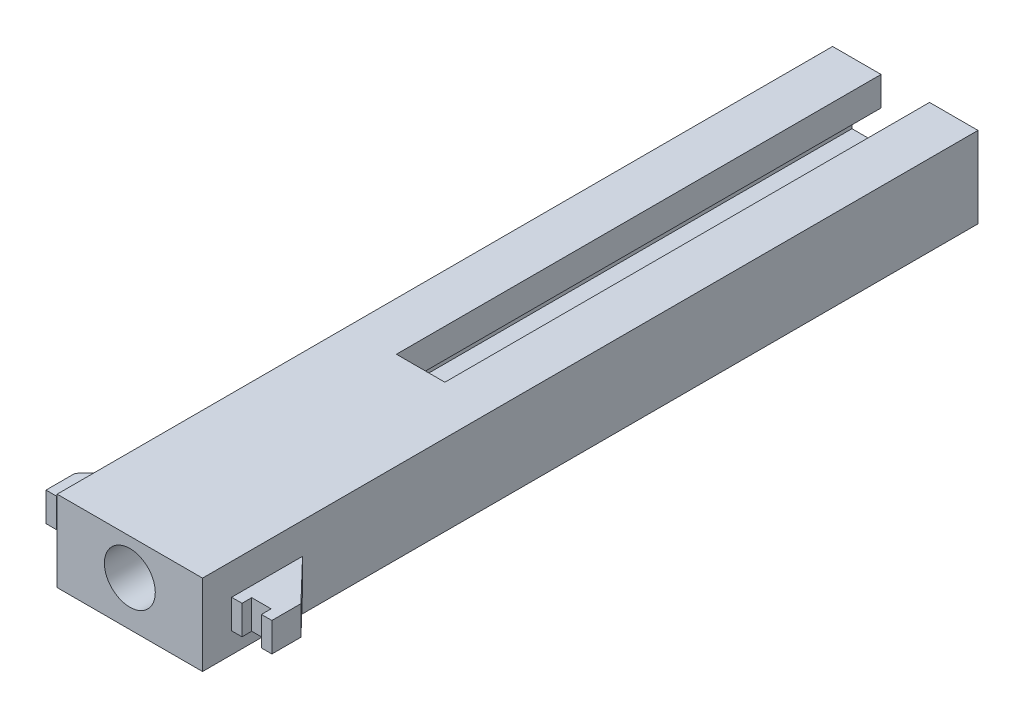
ISO-10303-21;
HEADER;
FILE_DESCRIPTION(('STEP AP214'),'2;1');
FILE_NAME('part.step','',(''),(''),'','','');
FILE_SCHEMA(('AUTOMOTIVE_DESIGN { 1 0 10303 214 1 1 1 1 }'));
ENDSEC;
DATA;
#1=APPLICATION_CONTEXT('core data for automotive mechanical design processes');
#2=APPLICATION_PROTOCOL_DEFINITION('international standard','automotive_design',2000,#1);
#3=PRODUCT_CONTEXT('',#1,'mechanical');
#4=PRODUCT('Part','Part','',(#3));
#5=PRODUCT_RELATED_PRODUCT_CATEGORY('part','',(#4));
#6=PRODUCT_DEFINITION_FORMATION('','',#4);
#7=PRODUCT_DEFINITION_CONTEXT('part definition',#1,'design');
#8=PRODUCT_DEFINITION('design','',#6,#7);
#9=PRODUCT_DEFINITION_SHAPE('','',#8);
#10=(LENGTH_UNIT() NAMED_UNIT(*) SI_UNIT(.MILLI.,.METRE.));
#11=(NAMED_UNIT(*) PLANE_ANGLE_UNIT() SI_UNIT($,.RADIAN.));
#12=(NAMED_UNIT(*) SI_UNIT($,.STERADIAN.) SOLID_ANGLE_UNIT());
#13=UNCERTAINTY_MEASURE_WITH_UNIT(LENGTH_MEASURE(1.E-05),#10,'distance_accuracy_value','');
#14=(GEOMETRIC_REPRESENTATION_CONTEXT(3) GLOBAL_UNCERTAINTY_ASSIGNED_CONTEXT((#13)) GLOBAL_UNIT_ASSIGNED_CONTEXT((#10,
#11,#12)) REPRESENTATION_CONTEXT('',''));
#15=CARTESIAN_POINT('',(0.,0.,0.));
#16=DIRECTION('',(0.,0.,1.));
#17=DIRECTION('',(1.,0.,0.));
#18=AXIS2_PLACEMENT_3D('',#15,#16,#17);
#19=CARTESIAN_POINT('',(-7.5,8.35,80.));
#20=DIRECTION('',(1.,0.,0.));
#21=DIRECTION('',(0.,1.,0.));
#22=AXIS2_PLACEMENT_3D('',#19,#20,#21);
#23=PLANE('',#22);
#24=DIRECTION('',(0.,-1.,0.));
#25=VECTOR('',#24,1.);
#26=CARTESIAN_POINT('',(-7.5,8.35,0.));
#27=LINE('',#26,#25);
#28=CARTESIAN_POINT('',(-7.5,8.35,0.));
#29=VERTEX_POINT('',#28);
#30=CARTESIAN_POINT('',(-7.5,0.,0.));
#31=VERTEX_POINT('',#30);
#32=EDGE_CURVE('E538',#29,#31,#27,.T.);
#33=ORIENTED_EDGE('',*,*,#32,.T.);
#34=DIRECTION('',(0.,0.,-1.));
#35=VECTOR('',#34,1.);
#36=CARTESIAN_POINT('',(-7.5,0.,80.));
#37=LINE('',#36,#35);
#38=CARTESIAN_POINT('',(-7.5,0.,80.));
#39=VERTEX_POINT('',#38);
#40=EDGE_CURVE('E546',#39,#31,#37,.T.);
#41=ORIENTED_EDGE('',*,*,#40,.F.);
#42=DIRECTION('',(0.,-1.,0.));
#43=VECTOR('',#42,1.);
#44=CARTESIAN_POINT('',(-7.5,8.35,80.));
#45=LINE('',#44,#43);
#46=CARTESIAN_POINT('',(-7.5,8.35,80.));
#47=VERTEX_POINT('',#46);
#48=EDGE_CURVE('E523',#47,#39,#45,.T.);
#49=ORIENTED_EDGE('',*,*,#48,.F.);
#50=DIRECTION('',(0.,0.,-1.));
#51=VECTOR('',#50,1.);
#52=CARTESIAN_POINT('',(-7.5,8.35,80.));
#53=LINE('',#52,#51);
#54=EDGE_CURVE('E550',#47,#29,#53,.T.);
#55=ORIENTED_EDGE('',*,*,#54,.T.);
#56=EDGE_LOOP('',(#33,#41,#49,#55));
#57=FACE_BOUND('',#56,.T.);
#58=DIRECTION('',(0.,1.,0.));
#59=VECTOR('',#58,1.);
#60=CARTESIAN_POINT('',(-7.5,-3.8464713053803,69.685450349093));
#61=LINE('',#60,#59);
#62=CARTESIAN_POINT('',(-7.5,2.14,69.685450349093));
#63=VERTEX_POINT('',#62);
#64=CARTESIAN_POINT('',(-7.5,5.14,69.685450349093));
#65=VERTEX_POINT('',#64);
#66=EDGE_CURVE('E272',#63,#65,#61,.T.);
#67=ORIENTED_EDGE('',*,*,#66,.T.);
#68=DIRECTION('',(0.,0.,1.));
#69=VECTOR('',#68,1.);
#70=CARTESIAN_POINT('',(-7.5,5.14,77.));
#71=LINE('',#70,#69);
#72=CARTESIAN_POINT('',(-7.5,5.14,77.));
#73=VERTEX_POINT('',#72);
#74=EDGE_CURVE('E61',#65,#73,#71,.T.);
#75=ORIENTED_EDGE('',*,*,#74,.T.);
#76=DIRECTION('',(0.,-1.,0.));
#77=VECTOR('',#76,1.);
#78=CARTESIAN_POINT('',(-7.5,5.14,77.));
#79=LINE('',#78,#77);
#80=CARTESIAN_POINT('',(-7.5,2.14,77.));
#81=VERTEX_POINT('',#80);
#82=EDGE_CURVE('E331',#73,#81,#79,.T.);
#83=ORIENTED_EDGE('',*,*,#82,.T.);
#84=DIRECTION('',(0.,0.,-1.));
#85=VECTOR('',#84,1.);
#86=CARTESIAN_POINT('',(-7.5,2.14,77.));
#87=LINE('',#86,#85);
#88=EDGE_CURVE('E68',#81,#63,#87,.T.);
#89=ORIENTED_EDGE('',*,*,#88,.T.);
#90=EDGE_LOOP('',(#67,#75,#83,#89));
#91=FACE_BOUND('',#90,.T.);
#92=ADVANCED_FACE('F45',(#57,#91),#23,.F.);
#93=CARTESIAN_POINT('',(7.5,8.35,80.));
#94=DIRECTION('',(-1.,0.,0.));
#95=DIRECTION('',(0.,-1.,0.));
#96=AXIS2_PLACEMENT_3D('',#93,#94,#95);
#97=PLANE('',#96);
#98=DIRECTION('',(0.,1.,0.));
#99=VECTOR('',#98,1.);
#100=CARTESIAN_POINT('',(7.5,8.35,0.));
#101=LINE('',#100,#99);
#102=CARTESIAN_POINT('',(7.5,0.,0.));
#103=VERTEX_POINT('',#102);
#104=CARTESIAN_POINT('',(7.5,8.35,0.));
#105=VERTEX_POINT('',#104);
#106=EDGE_CURVE('E514',#103,#105,#101,.T.);
#107=ORIENTED_EDGE('',*,*,#106,.T.);
#108=DIRECTION('',(0.,0.,-1.));
#109=VECTOR('',#108,1.);
#110=CARTESIAN_POINT('',(7.5,8.35,80.));
#111=LINE('',#110,#109);
#112=CARTESIAN_POINT('',(7.5,8.35,80.));
#113=VERTEX_POINT('',#112);
#114=EDGE_CURVE('E553',#113,#105,#111,.T.);
#115=ORIENTED_EDGE('',*,*,#114,.F.);
#116=DIRECTION('',(0.,1.,0.));
#117=VECTOR('',#116,1.);
#118=CARTESIAN_POINT('',(7.5,8.35,80.));
#119=LINE('',#118,#117);
#120=CARTESIAN_POINT('',(7.5,0.,80.));
#121=VERTEX_POINT('',#120);
#122=EDGE_CURVE('E515',#121,#113,#119,.T.);
#123=ORIENTED_EDGE('',*,*,#122,.F.);
#124=DIRECTION('',(0.,0.,-1.));
#125=VECTOR('',#124,1.);
#126=CARTESIAN_POINT('',(7.5,0.,80.));
#127=LINE('',#126,#125);
#128=EDGE_CURVE('E529',#121,#103,#127,.T.);
#129=ORIENTED_EDGE('',*,*,#128,.T.);
#130=EDGE_LOOP('',(#107,#115,#123,#129));
#131=FACE_BOUND('',#130,.T.);
#132=DIRECTION('',(0.,0.,1.));
#133=VECTOR('',#132,1.);
#134=CARTESIAN_POINT('',(7.5,5.14,77.));
#135=LINE('',#134,#133);
#136=CARTESIAN_POINT('',(7.5,5.14,69.685450349093));
#137=VERTEX_POINT('',#136);
#138=CARTESIAN_POINT('',(7.5,5.14,77.));
#139=VERTEX_POINT('',#138);
#140=EDGE_CURVE('E369',#137,#139,#135,.T.);
#141=ORIENTED_EDGE('',*,*,#140,.F.);
#142=DIRECTION('',(0.,1.,0.));
#143=VECTOR('',#142,1.);
#144=CARTESIAN_POINT('',(7.5,-3.8464713053803,69.685450349093));
#145=LINE('',#144,#143);
#146=CARTESIAN_POINT('',(7.5,2.14,69.685450349093));
#147=VERTEX_POINT('',#146);
#148=EDGE_CURVE('E282',#147,#137,#145,.T.);
#149=ORIENTED_EDGE('',*,*,#148,.F.);
#150=DIRECTION('',(0.,0.,-1.));
#151=VECTOR('',#150,1.);
#152=CARTESIAN_POINT('',(7.5,2.14,77.));
#153=LINE('',#152,#151);
#154=CARTESIAN_POINT('',(7.5,2.14,77.));
#155=VERTEX_POINT('',#154);
#156=EDGE_CURVE('E385',#155,#147,#153,.T.);
#157=ORIENTED_EDGE('',*,*,#156,.F.);
#158=DIRECTION('',(0.,-1.,0.));
#159=VECTOR('',#158,1.);
#160=CARTESIAN_POINT('',(7.5,5.14,77.));
#161=LINE('',#160,#159);
#162=EDGE_CURVE('E399',#139,#155,#161,.T.);
#163=ORIENTED_EDGE('',*,*,#162,.F.);
#164=EDGE_LOOP('',(#141,#149,#157,#163));
#165=FACE_BOUND('',#164,.T.);
#166=ADVANCED_FACE('F47',(#131,#165),#97,.F.);
#167=CARTESIAN_POINT('',(-11.65,2.14,77.));
#168=DIRECTION('',(0.,-1.,0.));
#169=DIRECTION('',(1.,0.,0.));
#170=AXIS2_PLACEMENT_3D('',#167,#168,#169);
#171=PLANE('',#170);
#172=DIRECTION('',(1.,0.,0.));
#173=VECTOR('',#172,1.);
#174=CARTESIAN_POINT('',(-11.65,2.14,77.));
#175=LINE('',#174,#173);
#176=CARTESIAN_POINT('',(-8.575,2.14,77.));
#177=VERTEX_POINT('',#176);
#178=EDGE_CURVE('E339',#177,#81,#175,.T.);
#179=ORIENTED_EDGE('',*,*,#178,.F.);
#180=DIRECTION('',(0.,0.,1.));
#181=VECTOR('',#180,1.);
#182=CARTESIAN_POINT('',(-8.575,2.14,76.));
#183=LINE('',#182,#181);
#184=CARTESIAN_POINT('',(-8.575,2.14,76.));
#185=VERTEX_POINT('',#184);
#186=EDGE_CURVE('E312',#185,#177,#183,.T.);
#187=ORIENTED_EDGE('',*,*,#186,.F.);
#188=DIRECTION('',(-1.,0.,0.));
#189=VECTOR('',#188,1.);
#190=CARTESIAN_POINT('',(-8.575,2.14,76.));
#191=LINE('',#190,#189);
#192=CARTESIAN_POINT('',(-10.575,2.14,76.));
#193=VERTEX_POINT('',#192);
#194=EDGE_CURVE('E301',#185,#193,#191,.T.);
#195=ORIENTED_EDGE('',*,*,#194,.T.);
#196=DIRECTION('',(0.,0.,1.));
#197=VECTOR('',#196,1.);
#198=CARTESIAN_POINT('',(-10.575,2.14,76.));
#199=LINE('',#198,#197);
#200=CARTESIAN_POINT('',(-10.575,2.14,77.));
#201=VERTEX_POINT('',#200);
#202=EDGE_CURVE('E315',#193,#201,#199,.T.);
#203=ORIENTED_EDGE('',*,*,#202,.T.);
#204=CARTESIAN_POINT('',(-11.65,2.14,77.));
#205=VERTEX_POINT('',#204);
#206=EDGE_CURVE('E340',#205,#201,#175,.T.);
#207=ORIENTED_EDGE('',*,*,#206,.F.);
#208=DIRECTION('',(0.,0.,-1.));
#209=VECTOR('',#208,1.);
#210=CARTESIAN_POINT('',(-11.65,2.14,77.));
#211=LINE('',#210,#209);
#212=CARTESIAN_POINT('',(-11.65,2.14,74.));
#213=VERTEX_POINT('',#212);
#214=EDGE_CURVE('E267',#205,#213,#211,.T.);
#215=ORIENTED_EDGE('',*,*,#214,.T.);
#216=DIRECTION('',(-0.693229748929092,0.,0.720716667768763));
#217=VECTOR('',#216,1.);
#218=CARTESIAN_POINT('',(-11.65,2.14000000000001,74.));
#219=LINE('',#218,#217);
#220=EDGE_CURVE('E265',#63,#213,#219,.T.);
#221=ORIENTED_EDGE('',*,*,#220,.F.);
#222=ORIENTED_EDGE('',*,*,#88,.F.);
#223=EDGE_LOOP('',(#179,#187,#195,#203,#207,#215,#221,#222));
#224=FACE_BOUND('',#223,.T.);
#225=ADVANCED_FACE('F611',(#224),#171,.T.);
#226=CARTESIAN_POINT('',(-11.65,5.14,77.));
#227=DIRECTION('',(0.,0.,1.));
#228=DIRECTION('',(1.,0.,0.));
#229=AXIS2_PLACEMENT_3D('',#226,#227,#228);
#230=PLANE('',#229);
#231=DIRECTION('',(1.,0.,0.));
#232=VECTOR('',#231,1.);
#233=CARTESIAN_POINT('',(-11.65,5.14,77.));
#234=LINE('',#233,#232);
#235=CARTESIAN_POINT('',(-8.575,5.14,77.));
#236=VERTEX_POINT('',#235);
#237=EDGE_CURVE('E257',#236,#73,#234,.T.);
#238=ORIENTED_EDGE('',*,*,#237,.F.);
#239=DIRECTION('',(0.,-1.,0.));
#240=VECTOR('',#239,1.);
#241=CARTESIAN_POINT('',(-8.575,5.14,77.));
#242=LINE('',#241,#240);
#243=EDGE_CURVE('E289',#236,#177,#242,.T.);
#244=ORIENTED_EDGE('',*,*,#243,.T.);
#245=ORIENTED_EDGE('',*,*,#178,.T.);
#246=ORIENTED_EDGE('',*,*,#82,.F.);
#247=EDGE_LOOP('',(#238,#244,#245,#246));
#248=FACE_BOUND('',#247,.T.);
#249=ADVANCED_FACE('F601',(#248),#230,.T.);
#250=ORIENTED_EDGE('',*,*,#206,.T.);
#251=DIRECTION('',(0.,1.,0.));
#252=VECTOR('',#251,1.);
#253=CARTESIAN_POINT('',(-10.575,5.14,77.));
#254=LINE('',#253,#252);
#255=CARTESIAN_POINT('',(-10.575,5.14,77.));
#256=VERTEX_POINT('',#255);
#257=EDGE_CURVE('E295',#201,#256,#254,.T.);
#258=ORIENTED_EDGE('',*,*,#257,.T.);
#259=CARTESIAN_POINT('',(-11.65,5.14,77.));
#260=VERTEX_POINT('',#259);
#261=EDGE_CURVE('E336',#260,#256,#234,.T.);
#262=ORIENTED_EDGE('',*,*,#261,.F.);
#263=DIRECTION('',(0.,-1.,0.));
#264=VECTOR('',#263,1.);
#265=CARTESIAN_POINT('',(-11.65,5.14,77.));
#266=LINE('',#265,#264);
#267=EDGE_CURVE('E254',#260,#205,#266,.T.);
#268=ORIENTED_EDGE('',*,*,#267,.T.);
#269=EDGE_LOOP('',(#250,#258,#262,#268));
#270=FACE_BOUND('',#269,.T.);
#271=ADVANCED_FACE('F783',(#270),#230,.T.);
#272=CARTESIAN_POINT('',(-11.65,5.14,77.));
#273=DIRECTION('',(0.,1.,0.));
#274=DIRECTION('',(-1.,0.,0.));
#275=AXIS2_PLACEMENT_3D('',#272,#273,#274);
#276=PLANE('',#275);
#277=DIRECTION('',(1.,0.,0.));
#278=VECTOR('',#277,1.);
#279=CARTESIAN_POINT('',(-8.575,5.14,76.));
#280=LINE('',#279,#278);
#281=CARTESIAN_POINT('',(-10.575,5.14,76.));
#282=VERTEX_POINT('',#281);
#283=CARTESIAN_POINT('',(-8.575,5.14,76.));
#284=VERTEX_POINT('',#283);
#285=EDGE_CURVE('E294',#282,#284,#280,.T.);
#286=ORIENTED_EDGE('',*,*,#285,.T.);
#287=DIRECTION('',(0.,0.,1.));
#288=VECTOR('',#287,1.);
#289=CARTESIAN_POINT('',(-8.575,5.14,76.));
#290=LINE('',#289,#288);
#291=EDGE_CURVE('E305',#284,#236,#290,.T.);
#292=ORIENTED_EDGE('',*,*,#291,.T.);
#293=ORIENTED_EDGE('',*,*,#237,.T.);
#294=ORIENTED_EDGE('',*,*,#74,.F.);
#295=DIRECTION('',(0.693229748929091,0.,-0.720716667768763));
#296=VECTOR('',#295,1.);
#297=CARTESIAN_POINT('',(-11.65,5.14,74.));
#298=LINE('',#297,#296);
#299=CARTESIAN_POINT('',(-11.65,5.14,74.));
#300=VERTEX_POINT('',#299);
#301=EDGE_CURVE('E264',#300,#65,#298,.T.);
#302=ORIENTED_EDGE('',*,*,#301,.F.);
#303=DIRECTION('',(0.,0.,1.));
#304=VECTOR('',#303,1.);
#305=CARTESIAN_POINT('',(-11.65,5.14,77.));
#306=LINE('',#305,#304);
#307=EDGE_CURVE('E247',#300,#260,#306,.T.);
#308=ORIENTED_EDGE('',*,*,#307,.T.);
#309=ORIENTED_EDGE('',*,*,#261,.T.);
#310=DIRECTION('',(0.,0.,1.));
#311=VECTOR('',#310,1.);
#312=CARTESIAN_POINT('',(-10.575,5.14,76.));
#313=LINE('',#312,#311);
#314=EDGE_CURVE('E319',#282,#256,#313,.T.);
#315=ORIENTED_EDGE('',*,*,#314,.F.);
#316=EDGE_LOOP('',(#286,#292,#293,#294,#302,#308,#309,#315));
#317=FACE_BOUND('',#316,.T.);
#318=ADVANCED_FACE('F270',(#317),#276,.T.);
#319=CARTESIAN_POINT('',(11.65,5.14,77.));
#320=DIRECTION('',(0.,0.,-1.));
#321=DIRECTION('',(-1.,0.,0.));
#322=AXIS2_PLACEMENT_3D('',#319,#320,#321);
#323=PLANE('',#322);
#324=DIRECTION('',(-1.,0.,0.));
#325=VECTOR('',#324,1.);
#326=CARTESIAN_POINT('',(11.65,2.14,77.));
#327=LINE('',#326,#325);
#328=CARTESIAN_POINT('',(8.575,2.14,77.));
#329=VERTEX_POINT('',#328);
#330=EDGE_CURVE('E395',#329,#155,#327,.T.);
#331=ORIENTED_EDGE('',*,*,#330,.F.);
#332=DIRECTION('',(0.,-1.,0.));
#333=VECTOR('',#332,1.);
#334=CARTESIAN_POINT('',(8.575,5.14,77.));
#335=LINE('',#334,#333);
#336=CARTESIAN_POINT('',(8.575,5.14,77.));
#337=VERTEX_POINT('',#336);
#338=EDGE_CURVE('E344',#337,#329,#335,.T.);
#339=ORIENTED_EDGE('',*,*,#338,.F.);
#340=DIRECTION('',(-1.,0.,0.));
#341=VECTOR('',#340,1.);
#342=CARTESIAN_POINT('',(11.65,5.14,77.));
#343=LINE('',#342,#341);
#344=EDGE_CURVE('E409',#337,#139,#343,.T.);
#345=ORIENTED_EDGE('',*,*,#344,.T.);
#346=ORIENTED_EDGE('',*,*,#162,.T.);
#347=EDGE_LOOP('',(#331,#339,#345,#346));
#348=FACE_BOUND('',#347,.T.);
#349=ADVANCED_FACE('F645',(#348),#323,.F.);
#350=CARTESIAN_POINT('',(0.,0.,50.));
#351=DIRECTION('',(0.,0.,-1.));
#352=DIRECTION('',(-1.,0.,0.));
#353=AXIS2_PLACEMENT_3D('',#350,#351,#352);
#354=PLANE('',#353);
#355=CARTESIAN_POINT('',(0.,4.625,50.));
#356=DIRECTION('',(0.,0.,-1.));
#357=DIRECTION('',(-1.,0.,0.));
#358=AXIS2_PLACEMENT_3D('',#355,#356,#357);
#359=CIRCLE('',#358,2.625);
#360=CARTESIAN_POINT('',(-2.5,5.42539052967911,50.));
#361=VERTEX_POINT('',#360);
#362=CARTESIAN_POINT('',(2.5,5.4253905296791,50.));
#363=VERTEX_POINT('',#362);
#364=EDGE_CURVE('E11',#361,#363,#359,.T.);
#365=ORIENTED_EDGE('',*,*,#364,.F.);
#366=DIRECTION('',(0.,-1.,0.));
#367=VECTOR('',#366,1.);
#368=CARTESIAN_POINT('',(-2.5,5.35,50.));
#369=LINE('',#368,#367);
#370=CARTESIAN_POINT('',(-2.5,8.35,50.));
#371=VERTEX_POINT('',#370);
#372=EDGE_CURVE('E448',#371,#361,#369,.T.);
#373=ORIENTED_EDGE('',*,*,#372,.F.);
#374=DIRECTION('',(-1.,0.,0.));
#375=VECTOR('',#374,1.);
#376=CARTESIAN_POINT('',(-2.5,8.35,50.));
#377=LINE('',#376,#375);
#378=CARTESIAN_POINT('',(2.5,8.35,50.));
#379=VERTEX_POINT('',#378);
#380=EDGE_CURVE('E443',#379,#371,#377,.T.);
#381=ORIENTED_EDGE('',*,*,#380,.F.);
#382=DIRECTION('',(0.,1.,0.));
#383=VECTOR('',#382,1.);
#384=CARTESIAN_POINT('',(2.5,8.35,50.));
#385=LINE('',#384,#383);
#386=EDGE_CURVE('E438',#363,#379,#385,.T.);
#387=ORIENTED_EDGE('',*,*,#386,.F.);
#388=EDGE_LOOP('',(#365,#373,#381,#387));
#389=FACE_BOUND('',#388,.T.);
#390=ADVANCED_FACE('F625',(#389),#354,.T.);
#391=CARTESIAN_POINT('',(0.,4.625,50.));
#392=DIRECTION('',(0.,0.,-1.));
#393=DIRECTION('',(-1.,0.,0.));
#394=AXIS2_PLACEMENT_3D('',#391,#392,#393);
#395=CIRCLE('',#394,2.625);
#396=CARTESIAN_POINT('',(0.,2.,50.));
#397=VERTEX_POINT('',#396);
#398=CARTESIAN_POINT('',(2.52289516230857,5.35,50.));
#399=VERTEX_POINT('',#398);
#400=EDGE_CURVE('E419',#397,#399,#395,.F.);
#401=ORIENTED_EDGE('',*,*,#400,.T.);
#402=DIRECTION('',(-1.,0.,0.));
#403=VECTOR('',#402,1.);
#404=CARTESIAN_POINT('',(2.5,5.35,50.));
#405=LINE('',#404,#403);
#406=CARTESIAN_POINT('',(5.5,5.35,50.));
#407=VERTEX_POINT('',#406);
#408=EDGE_CURVE('E434',#407,#399,#405,.T.);
#409=ORIENTED_EDGE('',*,*,#408,.F.);
#410=DIRECTION('',(0.,1.,0.));
#411=VECTOR('',#410,1.);
#412=CARTESIAN_POINT('',(5.5,5.35,50.));
#413=LINE('',#412,#411);
#414=CARTESIAN_POINT('',(5.5,2.,50.));
#415=VERTEX_POINT('',#414);
#416=EDGE_CURVE('E429',#415,#407,#413,.T.);
#417=ORIENTED_EDGE('',*,*,#416,.F.);
#418=DIRECTION('',(1.,0.,0.));
#419=VECTOR('',#418,1.);
#420=CARTESIAN_POINT('',(5.5,2.,50.));
#421=LINE('',#420,#419);
#422=EDGE_CURVE('E430',#397,#415,#421,.T.);
#423=ORIENTED_EDGE('',*,*,#422,.F.);
#424=EDGE_LOOP('',(#401,#409,#417,#423));
#425=FACE_BOUND('',#424,.T.);
#426=ADVANCED_FACE('F619',(#425),#354,.T.);
#427=CARTESIAN_POINT('',(-7.5,8.35,80.));
#428=DIRECTION('',(0.,-1.,0.));
#429=DIRECTION('',(0.,0.,-1.));
#430=AXIS2_PLACEMENT_3D('',#427,#428,#429);
#431=PLANE('',#430);
#432=DIRECTION('',(0.,0.,-1.));
#433=VECTOR('',#432,1.);
#434=CARTESIAN_POINT('',(2.5,8.35,50.));
#435=LINE('',#434,#433);
#436=CARTESIAN_POINT('',(2.5,8.35,0.));
#437=VERTEX_POINT('',#436);
#438=EDGE_CURVE('E501',#379,#437,#435,.T.);
#439=ORIENTED_EDGE('',*,*,#438,.F.);
#440=ORIENTED_EDGE('',*,*,#380,.T.);
#441=DIRECTION('',(0.,0.,-1.));
#442=VECTOR('',#441,1.);
#443=CARTESIAN_POINT('',(-2.5,8.35,50.));
#444=LINE('',#443,#442);
#445=CARTESIAN_POINT('',(-2.5,8.35,0.));
#446=VERTEX_POINT('',#445);
#447=EDGE_CURVE('E497',#371,#446,#444,.T.);
#448=ORIENTED_EDGE('',*,*,#447,.T.);
#449=DIRECTION('',(-1.,0.,0.));
#450=VECTOR('',#449,1.);
#451=CARTESIAN_POINT('',(-7.5,8.35,0.));
#452=LINE('',#451,#450);
#453=EDGE_CURVE('E533',#446,#29,#452,.T.);
#454=ORIENTED_EDGE('',*,*,#453,.T.);
#455=ORIENTED_EDGE('',*,*,#54,.F.);
#456=DIRECTION('',(-1.,0.,0.));
#457=VECTOR('',#456,1.);
#458=CARTESIAN_POINT('',(-7.5,8.35,80.));
#459=LINE('',#458,#457);
#460=EDGE_CURVE('E519',#113,#47,#459,.T.);
#461=ORIENTED_EDGE('',*,*,#460,.F.);
#462=ORIENTED_EDGE('',*,*,#114,.T.);
#463=EDGE_CURVE('E534',#105,#437,#452,.T.);
#464=ORIENTED_EDGE('',*,*,#463,.T.);
#465=EDGE_LOOP('',(#439,#440,#448,#454,#455,#461,#462,#464));
#466=FACE_BOUND('',#465,.T.);
#467=ADVANCED_FACE('F616',(#466),#431,.F.);
#468=CARTESIAN_POINT('',(0.,0.,0.));
#469=DIRECTION('',(0.,0.,1.));
#470=DIRECTION('',(1.,0.,0.));
#471=AXIS2_PLACEMENT_3D('',#468,#469,#470);
#472=PLANE('',#471);
#473=DIRECTION('',(0.,1.,0.));
#474=VECTOR('',#473,1.);
#475=CARTESIAN_POINT('',(2.5,8.35,0.));
#476=LINE('',#475,#474);
#477=CARTESIAN_POINT('',(2.5,5.35,0.));
#478=VERTEX_POINT('',#477);
#479=EDGE_CURVE('E472',#478,#437,#476,.T.);
#480=ORIENTED_EDGE('',*,*,#479,.T.);
#481=ORIENTED_EDGE('',*,*,#463,.F.);
#482=ORIENTED_EDGE('',*,*,#106,.F.);
#483=DIRECTION('',(1.,0.,0.));
#484=VECTOR('',#483,1.);
#485=CARTESIAN_POINT('',(-7.5,0.,0.));
#486=LINE('',#485,#484);
#487=EDGE_CURVE('E520',#31,#103,#486,.T.);
#488=ORIENTED_EDGE('',*,*,#487,.F.);
#489=ORIENTED_EDGE('',*,*,#32,.F.);
#490=ORIENTED_EDGE('',*,*,#453,.F.);
#491=DIRECTION('',(0.,-1.,0.));
#492=VECTOR('',#491,1.);
#493=CARTESIAN_POINT('',(-2.5,5.35,0.));
#494=LINE('',#493,#492);
#495=CARTESIAN_POINT('',(-2.5,5.35,0.));
#496=VERTEX_POINT('',#495);
#497=EDGE_CURVE('E476',#446,#496,#494,.T.);
#498=ORIENTED_EDGE('',*,*,#497,.T.);
#499=DIRECTION('',(-1.,0.,0.));
#500=VECTOR('',#499,1.);
#501=CARTESIAN_POINT('',(-5.5,5.35,0.));
#502=LINE('',#501,#500);
#503=CARTESIAN_POINT('',(-5.5,5.35,0.));
#504=VERTEX_POINT('',#503);
#505=EDGE_CURVE('E480',#496,#504,#502,.T.);
#506=ORIENTED_EDGE('',*,*,#505,.T.);
#507=DIRECTION('',(0.,-1.,0.));
#508=VECTOR('',#507,1.);
#509=CARTESIAN_POINT('',(-5.5,2.,0.));
#510=LINE('',#509,#508);
#511=CARTESIAN_POINT('',(-5.5,2.,0.));
#512=VERTEX_POINT('',#511);
#513=EDGE_CURVE('E484',#504,#512,#510,.T.);
#514=ORIENTED_EDGE('',*,*,#513,.T.);
#515=DIRECTION('',(1.,0.,0.));
#516=VECTOR('',#515,1.);
#517=CARTESIAN_POINT('',(5.5,2.,0.));
#518=LINE('',#517,#516);
#519=CARTESIAN_POINT('',(5.5,2.,0.));
#520=VERTEX_POINT('',#519);
#521=EDGE_CURVE('E423',#512,#520,#518,.T.);
#522=ORIENTED_EDGE('',*,*,#521,.T.);
#523=DIRECTION('',(0.,1.,0.));
#524=VECTOR('',#523,1.);
#525=CARTESIAN_POINT('',(5.5,5.35,0.));
#526=LINE('',#525,#524);
#527=CARTESIAN_POINT('',(5.5,5.35,0.));
#528=VERTEX_POINT('',#527);
#529=EDGE_CURVE('E464',#520,#528,#526,.T.);
#530=ORIENTED_EDGE('',*,*,#529,.T.);
#531=DIRECTION('',(-1.,0.,0.));
#532=VECTOR('',#531,1.);
#533=CARTESIAN_POINT('',(2.5,5.35,0.));
#534=LINE('',#533,#532);
#535=EDGE_CURVE('E468',#528,#478,#534,.T.);
#536=ORIENTED_EDGE('',*,*,#535,.T.);
#537=EDGE_LOOP('',(#480,#481,#482,#488,#489,#490,#498,#506,#514,#522,#530,#536));
#538=FACE_BOUND('',#537,.T.);
#539=ADVANCED_FACE('F618',(#538),#472,.F.);
#540=CARTESIAN_POINT('',(-7.5,0.,80.));
#541=DIRECTION('',(0.,1.,0.));
#542=DIRECTION('',(0.,0.,1.));
#543=AXIS2_PLACEMENT_3D('',#540,#541,#542);
#544=PLANE('',#543);
#545=ORIENTED_EDGE('',*,*,#487,.T.);
#546=ORIENTED_EDGE('',*,*,#128,.F.);
#547=DIRECTION('',(1.,0.,0.));
#548=VECTOR('',#547,1.);
#549=CARTESIAN_POINT('',(-7.5,0.,80.));
#550=LINE('',#549,#548);
#551=EDGE_CURVE('E526',#39,#121,#550,.T.);
#552=ORIENTED_EDGE('',*,*,#551,.F.);
#553=ORIENTED_EDGE('',*,*,#40,.T.);
#554=EDGE_LOOP('',(#545,#546,#552,#553));
#555=FACE_BOUND('',#554,.T.);
#556=ADVANCED_FACE('F614',(#555),#544,.F.);
#557=CARTESIAN_POINT('',(0.,0.,80.));
#558=DIRECTION('',(0.,0.,1.));
#559=DIRECTION('',(1.,0.,0.));
#560=AXIS2_PLACEMENT_3D('',#557,#558,#559);
#561=PLANE('',#560);
#562=CARTESIAN_POINT('',(0.,4.625,80.));
#563=DIRECTION('',(0.,0.,1.));
#564=DIRECTION('',(1.,0.,0.));
#565=AXIS2_PLACEMENT_3D('',#562,#563,#564);
#566=CIRCLE('',#565,2.625);
#567=CARTESIAN_POINT('',(2.625,4.625,80.));
#568=VERTEX_POINT('',#567);
#569=EDGE_CURVE('E414',#568,#568,#566,.T.);
#570=ORIENTED_EDGE('',*,*,#569,.F.);
#571=EDGE_LOOP('',(#570));
#572=FACE_BOUND('',#571,.T.);
#573=ORIENTED_EDGE('',*,*,#122,.T.);
#574=ORIENTED_EDGE('',*,*,#460,.T.);
#575=ORIENTED_EDGE('',*,*,#48,.T.);
#576=ORIENTED_EDGE('',*,*,#551,.T.);
#577=EDGE_LOOP('',(#573,#574,#575,#576));
#578=FACE_BOUND('',#577,.T.);
#579=ADVANCED_FACE('F680',(#572,#578),#561,.T.);
#580=CARTESIAN_POINT('',(5.5,2.,50.));
#581=DIRECTION('',(0.,1.,0.));
#582=DIRECTION('',(0.,0.,1.));
#583=AXIS2_PLACEMENT_3D('',#580,#581,#582);
#584=PLANE('',#583);
#585=ORIENTED_EDGE('',*,*,#521,.F.);
#586=DIRECTION('',(0.,0.,-1.));
#587=VECTOR('',#586,1.);
#588=CARTESIAN_POINT('',(-5.5,2.,50.));
#589=LINE('',#588,#587);
#590=CARTESIAN_POINT('',(-5.5,2.,50.));
#591=VERTEX_POINT('',#590);
#592=EDGE_CURVE('E460',#591,#512,#589,.T.);
#593=ORIENTED_EDGE('',*,*,#592,.F.);
#594=EDGE_CURVE('E425',#591,#397,#421,.T.);
#595=ORIENTED_EDGE('',*,*,#594,.T.);
#596=ORIENTED_EDGE('',*,*,#422,.T.);
#597=DIRECTION('',(0.,0.,-1.));
#598=VECTOR('',#597,1.);
#599=CARTESIAN_POINT('',(5.5,2.,50.));
#600=LINE('',#599,#598);
#601=EDGE_CURVE('E510',#415,#520,#600,.T.);
#602=ORIENTED_EDGE('',*,*,#601,.T.);
#603=EDGE_LOOP('',(#585,#593,#595,#596,#602));
#604=FACE_BOUND('',#603,.T.);
#605=ADVANCED_FACE('F676',(#604),#584,.T.);
#606=CARTESIAN_POINT('',(5.5,5.35,50.));
#607=DIRECTION('',(-1.,0.,0.));
#608=DIRECTION('',(0.,-1.,0.));
#609=AXIS2_PLACEMENT_3D('',#606,#607,#608);
#610=PLANE('',#609);
#611=ORIENTED_EDGE('',*,*,#529,.F.);
#612=ORIENTED_EDGE('',*,*,#601,.F.);
#613=ORIENTED_EDGE('',*,*,#416,.T.);
#614=DIRECTION('',(0.,0.,-1.));
#615=VECTOR('',#614,1.);
#616=CARTESIAN_POINT('',(5.5,5.35,50.));
#617=LINE('',#616,#615);
#618=EDGE_CURVE('E507',#407,#528,#617,.T.);
#619=ORIENTED_EDGE('',*,*,#618,.T.);
#620=EDGE_LOOP('',(#611,#612,#613,#619));
#621=FACE_BOUND('',#620,.T.);
#622=ADVANCED_FACE('F673',(#621),#610,.T.);
#623=CARTESIAN_POINT('',(2.5,5.35,50.));
#624=DIRECTION('',(0.,-1.,0.));
#625=DIRECTION('',(0.,0.,-1.));
#626=AXIS2_PLACEMENT_3D('',#623,#624,#625);
#627=PLANE('',#626);
#628=ORIENTED_EDGE('',*,*,#535,.F.);
#629=ORIENTED_EDGE('',*,*,#618,.F.);
#630=ORIENTED_EDGE('',*,*,#408,.T.);
#631=CARTESIAN_POINT('',(2.5,5.35,50.));
#632=VERTEX_POINT('',#631);
#633=EDGE_CURVE('E433',#399,#632,#405,.T.);
#634=ORIENTED_EDGE('',*,*,#633,.T.);
#635=DIRECTION('',(0.,0.,-1.));
#636=VECTOR('',#635,1.);
#637=CARTESIAN_POINT('',(2.5,5.35,50.));
#638=LINE('',#637,#636);
#639=EDGE_CURVE('E504',#632,#478,#638,.T.);
#640=ORIENTED_EDGE('',*,*,#639,.T.);
#641=EDGE_LOOP('',(#628,#629,#630,#634,#640));
#642=FACE_BOUND('',#641,.T.);
#643=ADVANCED_FACE('F639',(#642),#627,.T.);
#644=CARTESIAN_POINT('',(2.5,8.35,50.));
#645=DIRECTION('',(-1.,0.,0.));
#646=DIRECTION('',(0.,-1.,0.));
#647=AXIS2_PLACEMENT_3D('',#644,#645,#646);
#648=PLANE('',#647);
#649=ORIENTED_EDGE('',*,*,#479,.F.);
#650=ORIENTED_EDGE('',*,*,#639,.F.);
#651=EDGE_CURVE('E439',#632,#363,#385,.T.);
#652=ORIENTED_EDGE('',*,*,#651,.T.);
#653=ORIENTED_EDGE('',*,*,#386,.T.);
#654=ORIENTED_EDGE('',*,*,#438,.T.);
#655=EDGE_LOOP('',(#649,#650,#652,#653,#654));
#656=FACE_BOUND('',#655,.T.);
#657=ADVANCED_FACE('F632',(#656),#648,.T.);
#658=CARTESIAN_POINT('',(-2.5,5.35,50.));
#659=DIRECTION('',(1.,0.,0.));
#660=DIRECTION('',(0.,0.,-1.));
#661=AXIS2_PLACEMENT_3D('',#658,#659,#660);
#662=PLANE('',#661);
#663=ORIENTED_EDGE('',*,*,#497,.F.);
#664=ORIENTED_EDGE('',*,*,#447,.F.);
#665=ORIENTED_EDGE('',*,*,#372,.T.);
#666=CARTESIAN_POINT('',(-2.5,5.35,50.));
#667=VERTEX_POINT('',#666);
#668=EDGE_CURVE('E447',#361,#667,#369,.T.);
#669=ORIENTED_EDGE('',*,*,#668,.T.);
#670=DIRECTION('',(0.,0.,-1.));
#671=VECTOR('',#670,1.);
#672=CARTESIAN_POINT('',(-2.5,5.35,50.));
#673=LINE('',#672,#671);
#674=EDGE_CURVE('E494',#667,#496,#673,.T.);
#675=ORIENTED_EDGE('',*,*,#674,.T.);
#676=EDGE_LOOP('',(#663,#664,#665,#669,#675));
#677=FACE_BOUND('',#676,.T.);
#678=ADVANCED_FACE('F583',(#677),#662,.T.);
#679=CARTESIAN_POINT('',(-5.5,5.35,50.));
#680=DIRECTION('',(0.,-1.,0.));
#681=DIRECTION('',(0.,0.,-1.));
#682=AXIS2_PLACEMENT_3D('',#679,#680,#681);
#683=PLANE('',#682);
#684=ORIENTED_EDGE('',*,*,#505,.F.);
#685=ORIENTED_EDGE('',*,*,#674,.F.);
#686=DIRECTION('',(-1.,0.,0.));
#687=VECTOR('',#686,1.);
#688=CARTESIAN_POINT('',(-5.5,5.35,50.));
#689=LINE('',#688,#687);
#690=CARTESIAN_POINT('',(-2.52289516230857,5.35,50.));
#691=VERTEX_POINT('',#690);
#692=EDGE_CURVE('E453',#667,#691,#689,.T.);
#693=ORIENTED_EDGE('',*,*,#692,.T.);
#694=CARTESIAN_POINT('',(-5.5,5.35,50.));
#695=VERTEX_POINT('',#694);
#696=EDGE_CURVE('E452',#691,#695,#689,.T.);
#697=ORIENTED_EDGE('',*,*,#696,.T.);
#698=DIRECTION('',(0.,0.,-1.));
#699=VECTOR('',#698,1.);
#700=CARTESIAN_POINT('',(-5.5,5.35,50.));
#701=LINE('',#700,#699);
#702=EDGE_CURVE('E491',#695,#504,#701,.T.);
#703=ORIENTED_EDGE('',*,*,#702,.T.);
#704=EDGE_LOOP('',(#684,#685,#693,#697,#703));
#705=FACE_BOUND('',#704,.T.);
#706=ADVANCED_FACE('F581',(#705),#683,.T.);
#707=CARTESIAN_POINT('',(-5.5,2.,50.));
#708=DIRECTION('',(1.,0.,0.));
#709=DIRECTION('',(0.,1.,0.));
#710=AXIS2_PLACEMENT_3D('',#707,#708,#709);
#711=PLANE('',#710);
#712=ORIENTED_EDGE('',*,*,#513,.F.);
#713=ORIENTED_EDGE('',*,*,#702,.F.);
#714=DIRECTION('',(0.,-1.,0.));
#715=VECTOR('',#714,1.);
#716=CARTESIAN_POINT('',(-5.5,2.,50.));
#717=LINE('',#716,#715);
#718=EDGE_CURVE('E457',#695,#591,#717,.T.);
#719=ORIENTED_EDGE('',*,*,#718,.T.);
#720=ORIENTED_EDGE('',*,*,#592,.T.);
#721=EDGE_LOOP('',(#712,#713,#719,#720));
#722=FACE_BOUND('',#721,.T.);
#723=ADVANCED_FACE('F655',(#722),#711,.T.);
#724=EDGE_CURVE('E49',#397,#691,#359,.T.);
#725=ORIENTED_EDGE('',*,*,#724,.F.);
#726=ORIENTED_EDGE('',*,*,#594,.F.);
#727=ORIENTED_EDGE('',*,*,#718,.F.);
#728=ORIENTED_EDGE('',*,*,#696,.F.);
#729=EDGE_LOOP('',(#725,#726,#727,#728));
#730=FACE_BOUND('',#729,.T.);
#731=ADVANCED_FACE('F575',(#730),#354,.T.);
#732=CARTESIAN_POINT('',(0.,0.,50.));
#733=DIRECTION('',(0.,0.,-1.));
#734=DIRECTION('',(-1.,0.,0.));
#735=AXIS2_PLACEMENT_3D('',#732,#733,#734);
#736=PLANE('',#735);
#737=ORIENTED_EDGE('',*,*,#633,.F.);
#738=EDGE_CURVE('E424',#399,#363,#395,.F.);
#739=ORIENTED_EDGE('',*,*,#738,.T.);
#740=ORIENTED_EDGE('',*,*,#651,.F.);
#741=EDGE_LOOP('',(#737,#739,#740));
#742=FACE_BOUND('',#741,.T.);
#743=ADVANCED_FACE('F642',(#742),#736,.F.);
#744=ORIENTED_EDGE('',*,*,#668,.F.);
#745=EDGE_CURVE('E418',#361,#691,#395,.F.);
#746=ORIENTED_EDGE('',*,*,#745,.T.);
#747=ORIENTED_EDGE('',*,*,#692,.F.);
#748=EDGE_LOOP('',(#744,#746,#747));
#749=FACE_BOUND('',#748,.T.);
#750=ADVANCED_FACE('F571',(#749),#736,.F.);
#751=CARTESIAN_POINT('',(0.,4.625,42.5753787975413));
#752=DIRECTION('',(0.,0.,1.));
#753=DIRECTION('',(1.,0.,0.));
#754=AXIS2_PLACEMENT_3D('',#751,#752,#753);
#755=CYLINDRICAL_SURFACE('',#754,2.625);
#756=ORIENTED_EDGE('',*,*,#569,.T.);
#757=EDGE_LOOP('',(#756));
#758=FACE_BOUND('',#757,.T.);
#759=ORIENTED_EDGE('',*,*,#400,.F.);
#760=ORIENTED_EDGE('',*,*,#724,.T.);
#761=ORIENTED_EDGE('',*,*,#745,.F.);
#762=ORIENTED_EDGE('',*,*,#364,.T.);
#763=ORIENTED_EDGE('',*,*,#738,.F.);
#764=EDGE_LOOP('',(#759,#760,#761,#762,#763));
#765=FACE_BOUND('',#764,.T.);
#766=ADVANCED_FACE('F563',(#758,#765),#755,.F.);
#767=CARTESIAN_POINT('',(11.65,5.14,77.));
#768=DIRECTION('',(0.,-1.,0.));
#769=DIRECTION('',(1.,0.,0.));
#770=AXIS2_PLACEMENT_3D('',#767,#768,#769);
#771=PLANE('',#770);
#772=ORIENTED_EDGE('',*,*,#344,.F.);
#773=DIRECTION('',(0.,0.,1.));
#774=VECTOR('',#773,1.);
#775=CARTESIAN_POINT('',(8.575,5.14,76.));
#776=LINE('',#775,#774);
#777=CARTESIAN_POINT('',(8.575,5.14,76.));
#778=VERTEX_POINT('',#777);
#779=EDGE_CURVE('E366',#778,#337,#776,.T.);
#780=ORIENTED_EDGE('',*,*,#779,.F.);
#781=DIRECTION('',(-1.,0.,0.));
#782=VECTOR('',#781,1.);
#783=CARTESIAN_POINT('',(8.575,5.14,76.));
#784=LINE('',#783,#782);
#785=CARTESIAN_POINT('',(10.575,5.14,76.));
#786=VERTEX_POINT('',#785);
#787=EDGE_CURVE('E357',#786,#778,#784,.T.);
#788=ORIENTED_EDGE('',*,*,#787,.F.);
#789=DIRECTION('',(0.,0.,1.));
#790=VECTOR('',#789,1.);
#791=CARTESIAN_POINT('',(10.575,5.14,76.));
#792=LINE('',#791,#790);
#793=CARTESIAN_POINT('',(10.575,5.14,77.));
#794=VERTEX_POINT('',#793);
#795=EDGE_CURVE('E370',#786,#794,#792,.T.);
#796=ORIENTED_EDGE('',*,*,#795,.T.);
#797=CARTESIAN_POINT('',(11.65,5.14,77.));
#798=VERTEX_POINT('',#797);
#799=EDGE_CURVE('E410',#798,#794,#343,.T.);
#800=ORIENTED_EDGE('',*,*,#799,.F.);
#801=DIRECTION('',(0.,0.,1.));
#802=VECTOR('',#801,1.);
#803=CARTESIAN_POINT('',(11.65,5.14,77.));
#804=LINE('',#803,#802);
#805=CARTESIAN_POINT('',(11.65,5.14,74.));
#806=VERTEX_POINT('',#805);
#807=EDGE_CURVE('E384',#806,#798,#804,.T.);
#808=ORIENTED_EDGE('',*,*,#807,.F.);
#809=DIRECTION('',(-0.693229748929091,0.,-0.720716667768763));
#810=VECTOR('',#809,1.);
#811=CARTESIAN_POINT('',(11.65,5.14,74.));
#812=LINE('',#811,#810);
#813=EDGE_CURVE('E278',#806,#137,#812,.T.);
#814=ORIENTED_EDGE('',*,*,#813,.T.);
#815=ORIENTED_EDGE('',*,*,#140,.T.);
#816=EDGE_LOOP('',(#772,#780,#788,#796,#800,#808,#814,#815));
#817=FACE_BOUND('',#816,.T.);
#818=ADVANCED_FACE('F714',(#817),#771,.F.);
#819=ORIENTED_EDGE('',*,*,#799,.T.);
#820=DIRECTION('',(0.,1.,0.));
#821=VECTOR('',#820,1.);
#822=CARTESIAN_POINT('',(10.575,5.14,77.));
#823=LINE('',#822,#821);
#824=CARTESIAN_POINT('',(10.575,2.14,77.));
#825=VERTEX_POINT('',#824);
#826=EDGE_CURVE('E349',#825,#794,#823,.T.);
#827=ORIENTED_EDGE('',*,*,#826,.F.);
#828=CARTESIAN_POINT('',(11.65,2.14,77.));
#829=VERTEX_POINT('',#828);
#830=EDGE_CURVE('E405',#829,#825,#327,.T.);
#831=ORIENTED_EDGE('',*,*,#830,.F.);
#832=DIRECTION('',(0.,-1.,0.));
#833=VECTOR('',#832,1.);
#834=CARTESIAN_POINT('',(11.65,5.14,77.));
#835=LINE('',#834,#833);
#836=EDGE_CURVE('E388',#798,#829,#835,.T.);
#837=ORIENTED_EDGE('',*,*,#836,.F.);
#838=EDGE_LOOP('',(#819,#827,#831,#837));
#839=FACE_BOUND('',#838,.T.);
#840=ADVANCED_FACE('F651',(#839),#323,.F.);
#841=CARTESIAN_POINT('',(11.65,2.14,77.));
#842=DIRECTION('',(0.,1.,0.));
#843=DIRECTION('',(-1.,0.,0.));
#844=AXIS2_PLACEMENT_3D('',#841,#842,#843);
#845=PLANE('',#844);
#846=DIRECTION('',(1.,0.,0.));
#847=VECTOR('',#846,1.);
#848=CARTESIAN_POINT('',(8.575,2.14,76.));
#849=LINE('',#848,#847);
#850=CARTESIAN_POINT('',(8.575,2.14,76.));
#851=VERTEX_POINT('',#850);
#852=CARTESIAN_POINT('',(10.575,2.14,76.));
#853=VERTEX_POINT('',#852);
#854=EDGE_CURVE('E348',#851,#853,#849,.T.);
#855=ORIENTED_EDGE('',*,*,#854,.F.);
#856=DIRECTION('',(0.,0.,1.));
#857=VECTOR('',#856,1.);
#858=CARTESIAN_POINT('',(8.575,2.14,76.));
#859=LINE('',#858,#857);
#860=EDGE_CURVE('E361',#851,#329,#859,.T.);
#861=ORIENTED_EDGE('',*,*,#860,.T.);
#862=ORIENTED_EDGE('',*,*,#330,.T.);
#863=ORIENTED_EDGE('',*,*,#156,.T.);
#864=DIRECTION('',(0.693229748929091,0.,0.720716667768763));
#865=VECTOR('',#864,1.);
#866=CARTESIAN_POINT('',(11.65,2.14,74.));
#867=LINE('',#866,#865);
#868=CARTESIAN_POINT('',(11.65,2.14,74.));
#869=VERTEX_POINT('',#868);
#870=EDGE_CURVE('E286',#147,#869,#867,.T.);
#871=ORIENTED_EDGE('',*,*,#870,.T.);
#872=DIRECTION('',(0.,0.,-1.));
#873=VECTOR('',#872,1.);
#874=CARTESIAN_POINT('',(11.65,2.14,77.));
#875=LINE('',#874,#873);
#876=EDGE_CURVE('E391',#829,#869,#875,.T.);
#877=ORIENTED_EDGE('',*,*,#876,.F.);
#878=ORIENTED_EDGE('',*,*,#830,.T.);
#879=DIRECTION('',(0.,0.,1.));
#880=VECTOR('',#879,1.);
#881=CARTESIAN_POINT('',(10.575,2.14,76.));
#882=LINE('',#881,#880);
#883=EDGE_CURVE('E374',#853,#825,#882,.T.);
#884=ORIENTED_EDGE('',*,*,#883,.F.);
#885=EDGE_LOOP('',(#855,#861,#862,#863,#871,#877,#878,#884));
#886=FACE_BOUND('',#885,.T.);
#887=ADVANCED_FACE('F723',(#886),#845,.F.);
#888=CARTESIAN_POINT('',(11.65,0.,0.));
#889=DIRECTION('',(1.,0.,0.));
#890=DIRECTION('',(0.,0.,-1.));
#891=AXIS2_PLACEMENT_3D('',#888,#889,#890);
#892=PLANE('',#891);
#893=DIRECTION('',(0.,1.,0.));
#894=VECTOR('',#893,1.);
#895=CARTESIAN_POINT('',(11.65,5.14,74.));
#896=LINE('',#895,#894);
#897=EDGE_CURVE('E380',#869,#806,#896,.T.);
#898=ORIENTED_EDGE('',*,*,#897,.T.);
#899=ORIENTED_EDGE('',*,*,#807,.T.);
#900=ORIENTED_EDGE('',*,*,#836,.T.);
#901=ORIENTED_EDGE('',*,*,#876,.T.);
#902=EDGE_LOOP('',(#898,#899,#900,#901));
#903=FACE_BOUND('',#902,.T.);
#904=ADVANCED_FACE('F718',(#903),#892,.T.);
#905=CARTESIAN_POINT('',(8.575,5.14,76.));
#906=DIRECTION('',(-1.,0.,0.));
#907=DIRECTION('',(0.,0.,1.));
#908=AXIS2_PLACEMENT_3D('',#905,#906,#907);
#909=PLANE('',#908);
#910=ORIENTED_EDGE('',*,*,#338,.T.);
#911=ORIENTED_EDGE('',*,*,#860,.F.);
#912=DIRECTION('',(0.,-1.,0.));
#913=VECTOR('',#912,1.);
#914=CARTESIAN_POINT('',(8.575,5.14,76.));
#915=LINE('',#914,#913);
#916=EDGE_CURVE('E345',#778,#851,#915,.T.);
#917=ORIENTED_EDGE('',*,*,#916,.F.);
#918=ORIENTED_EDGE('',*,*,#779,.T.);
#919=EDGE_LOOP('',(#910,#911,#917,#918));
#920=FACE_BOUND('',#919,.T.);
#921=ADVANCED_FACE('F730',(#920),#909,.F.);
#922=CARTESIAN_POINT('',(10.575,5.14,76.));
#923=DIRECTION('',(1.,0.,0.));
#924=DIRECTION('',(0.,1.,0.));
#925=AXIS2_PLACEMENT_3D('',#922,#923,#924);
#926=PLANE('',#925);
#927=ORIENTED_EDGE('',*,*,#826,.T.);
#928=ORIENTED_EDGE('',*,*,#795,.F.);
#929=DIRECTION('',(0.,1.,0.));
#930=VECTOR('',#929,1.);
#931=CARTESIAN_POINT('',(10.575,5.14,76.));
#932=LINE('',#931,#930);
#933=EDGE_CURVE('E353',#853,#786,#932,.T.);
#934=ORIENTED_EDGE('',*,*,#933,.F.);
#935=ORIENTED_EDGE('',*,*,#883,.T.);
#936=EDGE_LOOP('',(#927,#928,#934,#935));
#937=FACE_BOUND('',#936,.T.);
#938=ADVANCED_FACE('F735',(#937),#926,.F.);
#939=CARTESIAN_POINT('',(0.,0.,76.));
#940=DIRECTION('',(0.,0.,1.));
#941=DIRECTION('',(1.,0.,0.));
#942=AXIS2_PLACEMENT_3D('',#939,#940,#941);
#943=PLANE('',#942);
#944=ORIENTED_EDGE('',*,*,#916,.T.);
#945=ORIENTED_EDGE('',*,*,#854,.T.);
#946=ORIENTED_EDGE('',*,*,#933,.T.);
#947=ORIENTED_EDGE('',*,*,#787,.T.);
#948=EDGE_LOOP('',(#944,#945,#946,#947));
#949=FACE_BOUND('',#948,.T.);
#950=ADVANCED_FACE('F733',(#949),#943,.T.);
#951=CARTESIAN_POINT('',(-11.65,0.,0.));
#952=DIRECTION('',(-1.,0.,0.));
#953=DIRECTION('',(0.,0.,-1.));
#954=AXIS2_PLACEMENT_3D('',#951,#952,#953);
#955=PLANE('',#954);
#956=DIRECTION('',(0.,1.,0.));
#957=VECTOR('',#956,1.);
#958=CARTESIAN_POINT('',(-11.65,5.14,74.));
#959=LINE('',#958,#957);
#960=EDGE_CURVE('E251',#213,#300,#959,.T.);
#961=ORIENTED_EDGE('',*,*,#960,.F.);
#962=ORIENTED_EDGE('',*,*,#214,.F.);
#963=ORIENTED_EDGE('',*,*,#267,.F.);
#964=ORIENTED_EDGE('',*,*,#307,.F.);
#965=EDGE_LOOP('',(#961,#962,#963,#964));
#966=FACE_BOUND('',#965,.T.);
#967=ADVANCED_FACE('F249',(#966),#955,.T.);
#968=CARTESIAN_POINT('',(-8.575,5.14,76.));
#969=DIRECTION('',(-1.,0.,0.));
#970=DIRECTION('',(0.,0.,1.));
#971=AXIS2_PLACEMENT_3D('',#968,#969,#970);
#972=PLANE('',#971);
#973=ORIENTED_EDGE('',*,*,#243,.F.);
#974=ORIENTED_EDGE('',*,*,#291,.F.);
#975=DIRECTION('',(0.,-1.,0.));
#976=VECTOR('',#975,1.);
#977=CARTESIAN_POINT('',(-8.575,5.14,76.));
#978=LINE('',#977,#976);
#979=EDGE_CURVE('E290',#284,#185,#978,.T.);
#980=ORIENTED_EDGE('',*,*,#979,.T.);
#981=ORIENTED_EDGE('',*,*,#186,.T.);
#982=EDGE_LOOP('',(#973,#974,#980,#981));
#983=FACE_BOUND('',#982,.T.);
#984=ADVANCED_FACE('F853',(#983),#972,.T.);
#985=CARTESIAN_POINT('',(-10.575,5.14,76.));
#986=DIRECTION('',(1.,0.,0.));
#987=DIRECTION('',(0.,1.,0.));
#988=AXIS2_PLACEMENT_3D('',#985,#986,#987);
#989=PLANE('',#988);
#990=ORIENTED_EDGE('',*,*,#257,.F.);
#991=ORIENTED_EDGE('',*,*,#202,.F.);
#992=DIRECTION('',(0.,1.,0.));
#993=VECTOR('',#992,1.);
#994=CARTESIAN_POINT('',(-10.575,5.14,76.));
#995=LINE('',#994,#993);
#996=EDGE_CURVE('E298',#193,#282,#995,.T.);
#997=ORIENTED_EDGE('',*,*,#996,.T.);
#998=ORIENTED_EDGE('',*,*,#314,.T.);
#999=EDGE_LOOP('',(#990,#991,#997,#998));
#1000=FACE_BOUND('',#999,.T.);
#1001=ADVANCED_FACE('F863',(#1000),#989,.T.);
#1002=CARTESIAN_POINT('',(0.,0.,76.));
#1003=DIRECTION('',(0.,0.,1.));
#1004=DIRECTION('',(-1.,0.,0.));
#1005=AXIS2_PLACEMENT_3D('',#1002,#1003,#1004);
#1006=PLANE('',#1005);
#1007=ORIENTED_EDGE('',*,*,#979,.F.);
#1008=ORIENTED_EDGE('',*,*,#285,.F.);
#1009=ORIENTED_EDGE('',*,*,#996,.F.);
#1010=ORIENTED_EDGE('',*,*,#194,.F.);
#1011=EDGE_LOOP('',(#1007,#1008,#1009,#1010));
#1012=FACE_BOUND('',#1011,.T.);
#1013=ADVANCED_FACE('F873',(#1012),#1006,.T.);
#1014=CARTESIAN_POINT('',(11.65,-3.8464713053803,74.));
#1015=DIRECTION('',(0.720716667768763,0.,-0.693229748929091));
#1016=DIRECTION('',(-0.693229748929091,0.,-0.720716667768763));
#1017=AXIS2_PLACEMENT_3D('',#1014,#1015,#1016);
#1018=PLANE('',#1017);
#1019=ORIENTED_EDGE('',*,*,#870,.F.);
#1020=ORIENTED_EDGE('',*,*,#148,.T.);
#1021=ORIENTED_EDGE('',*,*,#813,.F.);
#1022=ORIENTED_EDGE('',*,*,#897,.F.);
#1023=EDGE_LOOP('',(#1019,#1020,#1021,#1022));
#1024=FACE_BOUND('',#1023,.T.);
#1025=ADVANCED_FACE('F711',(#1024),#1018,.T.);
#1026=CARTESIAN_POINT('',(-11.65,-3.8464713053803,74.));
#1027=DIRECTION('',(0.720716667768763,0.,0.693229748929091));
#1028=DIRECTION('',(0.693229748929091,0.,-0.720716667768763));
#1029=AXIS2_PLACEMENT_3D('',#1026,#1027,#1028);
#1030=PLANE('',#1029);
#1031=ORIENTED_EDGE('',*,*,#66,.F.);
#1032=ORIENTED_EDGE('',*,*,#220,.T.);
#1033=ORIENTED_EDGE('',*,*,#960,.T.);
#1034=ORIENTED_EDGE('',*,*,#301,.T.);
#1035=EDGE_LOOP('',(#1031,#1032,#1033,#1034));
#1036=FACE_BOUND('',#1035,.T.);
#1037=ADVANCED_FACE('F263',(#1036),#1030,.F.);
#1038=CLOSED_SHELL('',(#92,#166,#225,#249,#271,#318,#349,#390,#426,#467,#539,#556,#579,#605,
#622,#643,#657,#678,#706,#723,#731,#743,#750,#766,#818,#840,#887,#904,#921,#938,#950,#967,#984,
#1001,#1013,#1025,#1037));
#1039=MANIFOLD_SOLID_BREP('B2',#1038);
#1040=ADVANCED_BREP_SHAPE_REPRESENTATION('',(#18,#1039),#14);
#1041=SHAPE_DEFINITION_REPRESENTATION(#9,#1040);
ENDSEC;
END-ISO-10303-21;
